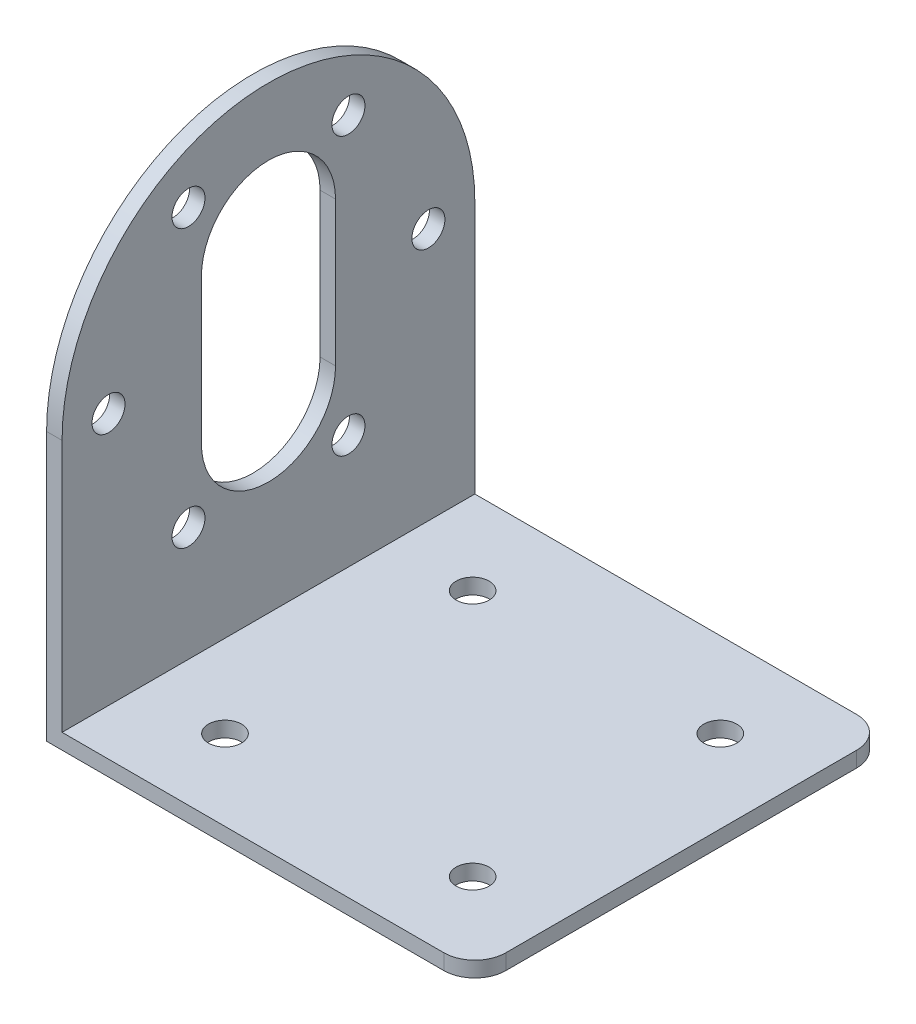
ISO-10303-21;
HEADER;
FILE_DESCRIPTION(('STEP AP214'),'2;1');
FILE_NAME('part.step','',(''),(''),'','','');
FILE_SCHEMA(('AUTOMOTIVE_DESIGN { 1 0 10303 214 1 1 1 1 }'));
ENDSEC;
DATA;
#1=APPLICATION_CONTEXT('core data for automotive mechanical design processes');
#2=APPLICATION_PROTOCOL_DEFINITION('international standard','automotive_design',2000,#1);
#3=PRODUCT_CONTEXT('',#1,'mechanical');
#4=PRODUCT('Part','Part','',(#3));
#5=PRODUCT_RELATED_PRODUCT_CATEGORY('part','',(#4));
#6=PRODUCT_DEFINITION_FORMATION('','',#4);
#7=PRODUCT_DEFINITION_CONTEXT('part definition',#1,'design');
#8=PRODUCT_DEFINITION('design','',#6,#7);
#9=PRODUCT_DEFINITION_SHAPE('','',#8);
#10=(LENGTH_UNIT() NAMED_UNIT(*) SI_UNIT(.MILLI.,.METRE.));
#11=(NAMED_UNIT(*) PLANE_ANGLE_UNIT() SI_UNIT($,.RADIAN.));
#12=(NAMED_UNIT(*) SI_UNIT($,.STERADIAN.) SOLID_ANGLE_UNIT());
#13=UNCERTAINTY_MEASURE_WITH_UNIT(LENGTH_MEASURE(1.E-05),#10,'distance_accuracy_value','');
#14=(GEOMETRIC_REPRESENTATION_CONTEXT(3) GLOBAL_UNCERTAINTY_ASSIGNED_CONTEXT((#13)) GLOBAL_UNIT_ASSIGNED_CONTEXT((#10,
#11,#12)) REPRESENTATION_CONTEXT('',''));
#15=CARTESIAN_POINT('',(0.,0.,0.));
#16=DIRECTION('',(0.,0.,1.));
#17=DIRECTION('',(1.,0.,0.));
#18=AXIS2_PLACEMENT_3D('',#15,#16,#17);
#19=CARTESIAN_POINT('',(0.,1.5,0.));
#20=DIRECTION('',(1.,0.,0.));
#21=DIRECTION('',(0.,0.,-1.));
#22=AXIS2_PLACEMENT_3D('',#19,#20,#21);
#23=PLANE('',#22);
#24=CARTESIAN_POINT('',(0.,39.4233937586586,-12.2499999999997));
#25=DIRECTION('',(-1.,0.,0.));
#26=DIRECTION('',(0.,0.,1.));
#27=AXIS2_PLACEMENT_3D('',#24,#25,#26);
#28=CIRCLE('',#27,1.6);
#29=CARTESIAN_POINT('',(0.,39.4233937586586,-10.6499999999997));
#30=VERTEX_POINT('',#29);
#31=EDGE_CURVE('E265',#30,#30,#28,.T.);
#32=ORIENTED_EDGE('',*,*,#31,.F.);
#33=EDGE_LOOP('',(#32));
#34=FACE_BOUND('',#33,.T.);
#35=CARTESIAN_POINT('',(0.,25.9999999999999,-4.49999999999962));
#36=DIRECTION('',(-1.,0.,0.));
#37=DIRECTION('',(0.,0.,1.));
#38=AXIS2_PLACEMENT_3D('',#35,#36,#37);
#39=CIRCLE('',#38,1.6);
#40=CARTESIAN_POINT('',(0.,25.9999999999999,-2.89999999999961));
#41=VERTEX_POINT('',#40);
#42=EDGE_CURVE('E261',#41,#41,#39,.T.);
#43=ORIENTED_EDGE('',*,*,#42,.F.);
#44=EDGE_LOOP('',(#43));
#45=FACE_BOUND('',#44,.T.);
#46=CARTESIAN_POINT('',(0.,12.576606241341,-12.2499999999995));
#47=DIRECTION('',(-1.,0.,0.));
#48=DIRECTION('',(0.,0.,1.));
#49=AXIS2_PLACEMENT_3D('',#46,#47,#48);
#50=CIRCLE('',#49,1.6);
#51=CARTESIAN_POINT('',(0.,12.576606241341,-10.6499999999995));
#52=VERTEX_POINT('',#51);
#53=EDGE_CURVE('E257',#52,#52,#50,.T.);
#54=ORIENTED_EDGE('',*,*,#53,.F.);
#55=EDGE_LOOP('',(#54));
#56=FACE_BOUND('',#55,.T.);
#57=CARTESIAN_POINT('',(0.,12.5766062413409,-27.7499999999995));
#58=DIRECTION('',(-1.,0.,0.));
#59=DIRECTION('',(0.,0.,1.));
#60=AXIS2_PLACEMENT_3D('',#57,#58,#59);
#61=CIRCLE('',#60,1.6);
#62=CARTESIAN_POINT('',(0.,12.5766062413409,-26.1499999999995));
#63=VERTEX_POINT('',#62);
#64=EDGE_CURVE('E253',#63,#63,#61,.T.);
#65=ORIENTED_EDGE('',*,*,#64,.F.);
#66=EDGE_LOOP('',(#65));
#67=FACE_BOUND('',#66,.T.);
#68=CARTESIAN_POINT('',(0.,25.9999999999997,-35.4999999999996));
#69=DIRECTION('',(-1.,0.,0.));
#70=DIRECTION('',(0.,0.,1.));
#71=AXIS2_PLACEMENT_3D('',#68,#69,#70);
#72=CIRCLE('',#71,1.6);
#73=CARTESIAN_POINT('',(0.,25.9999999999997,-33.8999999999996));
#74=VERTEX_POINT('',#73);
#75=EDGE_CURVE('E249',#74,#74,#72,.T.);
#76=ORIENTED_EDGE('',*,*,#75,.F.);
#77=EDGE_LOOP('',(#76));
#78=FACE_BOUND('',#77,.T.);
#79=CARTESIAN_POINT('',(0.,39.4233937586585,-27.7499999999997));
#80=DIRECTION('',(-1.,0.,0.));
#81=DIRECTION('',(0.,0.,1.));
#82=AXIS2_PLACEMENT_3D('',#79,#80,#81);
#83=CIRCLE('',#82,1.6);
#84=CARTESIAN_POINT('',(0.,39.4233937586585,-26.1499999999997));
#85=VERTEX_POINT('',#84);
#86=EDGE_CURVE('E198',#85,#85,#83,.T.);
#87=ORIENTED_EDGE('',*,*,#86,.F.);
#88=EDGE_LOOP('',(#87));
#89=FACE_BOUND('',#88,.T.);
#90=DIRECTION('',(0.,-1.,0.));
#91=VECTOR('',#90,1.);
#92=CARTESIAN_POINT('',(0.,1.5,0.));
#93=LINE('',#92,#91);
#94=CARTESIAN_POINT('',(0.,26.,0.));
#95=VERTEX_POINT('',#94);
#96=CARTESIAN_POINT('',(0.,0.,0.));
#97=VERTEX_POINT('',#96);
#98=EDGE_CURVE('E284',#95,#97,#93,.T.);
#99=ORIENTED_EDGE('',*,*,#98,.F.);
#100=CARTESIAN_POINT('',(0.,26.,-20.));
#101=DIRECTION('',(-1.,0.,0.));
#102=DIRECTION('',(0.,0.,1.));
#103=AXIS2_PLACEMENT_3D('',#100,#101,#102);
#104=CIRCLE('',#103,20.);
#105=CARTESIAN_POINT('',(0.,26.,-40.));
#106=VERTEX_POINT('',#105);
#107=EDGE_CURVE('E217',#106,#95,#104,.F.);
#108=ORIENTED_EDGE('',*,*,#107,.F.);
#109=DIRECTION('',(0.,-1.,0.));
#110=VECTOR('',#109,1.);
#111=CARTESIAN_POINT('',(0.,1.5,-40.));
#112=LINE('',#111,#110);
#113=CARTESIAN_POINT('',(0.,0.,-40.));
#114=VERTEX_POINT('',#113);
#115=EDGE_CURVE('E269',#106,#114,#112,.T.);
#116=ORIENTED_EDGE('',*,*,#115,.T.);
#117=DIRECTION('',(0.,0.,1.));
#118=VECTOR('',#117,1.);
#119=CARTESIAN_POINT('',(0.,0.,0.));
#120=LINE('',#119,#118);
#121=EDGE_CURVE('E243',#114,#97,#120,.T.);
#122=ORIENTED_EDGE('',*,*,#121,.T.);
#123=EDGE_LOOP('',(#99,#108,#116,#122));
#124=FACE_BOUND('',#123,.T.);
#125=DIRECTION('',(0.,1.,0.));
#126=VECTOR('',#125,1.);
#127=CARTESIAN_POINT('',(0.,0.,-26.5));
#128=LINE('',#127,#126);
#129=CARTESIAN_POINT('',(0.,19.,-26.5));
#130=VERTEX_POINT('',#129);
#131=CARTESIAN_POINT('',(0.,33.,-26.5));
#132=VERTEX_POINT('',#131);
#133=EDGE_CURVE('E175',#130,#132,#128,.T.);
#134=ORIENTED_EDGE('',*,*,#133,.T.);
#135=CARTESIAN_POINT('',(0.,33.,-20.));
#136=DIRECTION('',(-1.,0.,0.));
#137=DIRECTION('',(0.,0.,1.));
#138=AXIS2_PLACEMENT_3D('',#135,#136,#137);
#139=CIRCLE('',#138,6.5);
#140=CARTESIAN_POINT('',(0.,33.,-13.5));
#141=VERTEX_POINT('',#140);
#142=EDGE_CURVE('E192',#132,#141,#139,.F.);
#143=ORIENTED_EDGE('',*,*,#142,.T.);
#144=DIRECTION('',(0.,1.,0.));
#145=VECTOR('',#144,1.);
#146=CARTESIAN_POINT('',(0.,0.,-13.5));
#147=LINE('',#146,#145);
#148=CARTESIAN_POINT('',(0.,19.,-13.5));
#149=VERTEX_POINT('',#148);
#150=EDGE_CURVE('E195',#149,#141,#147,.T.);
#151=ORIENTED_EDGE('',*,*,#150,.F.);
#152=CARTESIAN_POINT('',(0.,19.,-20.));
#153=DIRECTION('',(-1.,0.,0.));
#154=DIRECTION('',(0.,0.,1.));
#155=AXIS2_PLACEMENT_3D('',#152,#153,#154);
#156=CIRCLE('',#155,6.5);
#157=EDGE_CURVE('E204',#130,#149,#156,.T.);
#158=ORIENTED_EDGE('',*,*,#157,.F.);
#159=EDGE_LOOP('',(#134,#143,#151,#158));
#160=FACE_BOUND('',#159,.T.);
#161=ADVANCED_FACE('F77',(#34,#45,#56,#67,#78,#89,#124,#160),#23,.F.);
#162=CARTESIAN_POINT('',(1.5,46.,-40.));
#163=DIRECTION('',(-1.,0.,0.));
#164=DIRECTION('',(0.,0.,1.));
#165=AXIS2_PLACEMENT_3D('',#162,#163,#164);
#166=PLANE('',#165);
#167=CARTESIAN_POINT('',(1.5,39.4233937586586,-12.2499999999997));
#168=DIRECTION('',(-1.,0.,0.));
#169=DIRECTION('',(0.,0.,1.));
#170=AXIS2_PLACEMENT_3D('',#167,#168,#169);
#171=CIRCLE('',#170,1.59999999999999);
#172=CARTESIAN_POINT('',(1.5,39.4233937586586,-10.6499999999997));
#173=VERTEX_POINT('',#172);
#174=EDGE_CURVE('E262',#173,#173,#171,.T.);
#175=ORIENTED_EDGE('',*,*,#174,.T.);
#176=EDGE_LOOP('',(#175));
#177=FACE_BOUND('',#176,.T.);
#178=CARTESIAN_POINT('',(1.5,25.9999999999999,-4.49999999999962));
#179=DIRECTION('',(-1.,0.,0.));
#180=DIRECTION('',(0.,0.,1.));
#181=AXIS2_PLACEMENT_3D('',#178,#179,#180);
#182=CIRCLE('',#181,1.6);
#183=CARTESIAN_POINT('',(1.5,25.9999999999999,-2.89999999999962));
#184=VERTEX_POINT('',#183);
#185=EDGE_CURVE('E258',#184,#184,#182,.T.);
#186=ORIENTED_EDGE('',*,*,#185,.T.);
#187=EDGE_LOOP('',(#186));
#188=FACE_BOUND('',#187,.T.);
#189=CARTESIAN_POINT('',(1.5,12.576606241341,-12.2499999999995));
#190=DIRECTION('',(-1.,0.,0.));
#191=DIRECTION('',(0.,0.,1.));
#192=AXIS2_PLACEMENT_3D('',#189,#190,#191);
#193=CIRCLE('',#192,1.6);
#194=CARTESIAN_POINT('',(1.5,12.576606241341,-10.6499999999995));
#195=VERTEX_POINT('',#194);
#196=EDGE_CURVE('E254',#195,#195,#193,.T.);
#197=ORIENTED_EDGE('',*,*,#196,.T.);
#198=EDGE_LOOP('',(#197));
#199=FACE_BOUND('',#198,.T.);
#200=CARTESIAN_POINT('',(1.5,12.5766062413409,-27.7499999999995));
#201=DIRECTION('',(-1.,0.,0.));
#202=DIRECTION('',(0.,0.,1.));
#203=AXIS2_PLACEMENT_3D('',#200,#201,#202);
#204=CIRCLE('',#203,1.6);
#205=CARTESIAN_POINT('',(1.5,12.5766062413409,-26.1499999999995));
#206=VERTEX_POINT('',#205);
#207=EDGE_CURVE('E250',#206,#206,#204,.T.);
#208=ORIENTED_EDGE('',*,*,#207,.T.);
#209=EDGE_LOOP('',(#208));
#210=FACE_BOUND('',#209,.T.);
#211=CARTESIAN_POINT('',(1.5,25.9999999999997,-35.4999999999996));
#212=DIRECTION('',(-1.,0.,0.));
#213=DIRECTION('',(0.,0.,1.));
#214=AXIS2_PLACEMENT_3D('',#211,#212,#213);
#215=CIRCLE('',#214,1.6);
#216=CARTESIAN_POINT('',(1.5,25.9999999999997,-33.8999999999996));
#217=VERTEX_POINT('',#216);
#218=EDGE_CURVE('E246',#217,#217,#215,.T.);
#219=ORIENTED_EDGE('',*,*,#218,.T.);
#220=EDGE_LOOP('',(#219));
#221=FACE_BOUND('',#220,.T.);
#222=CARTESIAN_POINT('',(1.5,39.4233937586585,-27.7499999999997));
#223=DIRECTION('',(-1.,0.,0.));
#224=DIRECTION('',(0.,0.,1.));
#225=AXIS2_PLACEMENT_3D('',#222,#223,#224);
#226=CIRCLE('',#225,1.59999999999999);
#227=CARTESIAN_POINT('',(1.5,39.4233937586585,-26.1499999999997));
#228=VERTEX_POINT('',#227);
#229=EDGE_CURVE('E205',#228,#228,#226,.T.);
#230=ORIENTED_EDGE('',*,*,#229,.T.);
#231=EDGE_LOOP('',(#230));
#232=FACE_BOUND('',#231,.T.);
#233=CARTESIAN_POINT('',(1.5,26.,-20.));
#234=DIRECTION('',(-1.,0.,0.));
#235=DIRECTION('',(0.,0.,1.));
#236=AXIS2_PLACEMENT_3D('',#233,#234,#235);
#237=CIRCLE('',#236,20.);
#238=CARTESIAN_POINT('',(1.5,26.,-40.));
#239=VERTEX_POINT('',#238);
#240=CARTESIAN_POINT('',(1.5,26.,0.));
#241=VERTEX_POINT('',#240);
#242=EDGE_CURVE('E218',#239,#241,#237,.F.);
#243=ORIENTED_EDGE('',*,*,#242,.T.);
#244=DIRECTION('',(0.,-1.,0.));
#245=VECTOR('',#244,1.);
#246=CARTESIAN_POINT('',(1.50000000000001,46.,0.));
#247=LINE('',#246,#245);
#248=CARTESIAN_POINT('',(1.5,1.5,0.));
#249=VERTEX_POINT('',#248);
#250=EDGE_CURVE('E241',#241,#249,#247,.T.);
#251=ORIENTED_EDGE('',*,*,#250,.T.);
#252=DIRECTION('',(0.,0.,-1.));
#253=VECTOR('',#252,1.);
#254=CARTESIAN_POINT('',(1.5,1.5,-40.));
#255=LINE('',#254,#253);
#256=CARTESIAN_POINT('',(1.5,1.5,-40.));
#257=VERTEX_POINT('',#256);
#258=EDGE_CURVE('E223',#249,#257,#255,.T.);
#259=ORIENTED_EDGE('',*,*,#258,.T.);
#260=DIRECTION('',(0.,-1.,0.));
#261=VECTOR('',#260,1.);
#262=CARTESIAN_POINT('',(1.5,46.,-40.));
#263=LINE('',#262,#261);
#264=EDGE_CURVE('E232',#239,#257,#263,.T.);
#265=ORIENTED_EDGE('',*,*,#264,.F.);
#266=EDGE_LOOP('',(#243,#251,#259,#265));
#267=FACE_BOUND('',#266,.T.);
#268=DIRECTION('',(0.,1.,0.));
#269=VECTOR('',#268,1.);
#270=CARTESIAN_POINT('',(1.5,0.,-26.5));
#271=LINE('',#270,#269);
#272=CARTESIAN_POINT('',(1.5,19.,-26.5));
#273=VERTEX_POINT('',#272);
#274=CARTESIAN_POINT('',(1.5,33.,-26.5));
#275=VERTEX_POINT('',#274);
#276=EDGE_CURVE('E172',#273,#275,#271,.T.);
#277=ORIENTED_EDGE('',*,*,#276,.F.);
#278=CARTESIAN_POINT('',(1.5,19.,-20.));
#279=DIRECTION('',(-1.,0.,0.));
#280=DIRECTION('',(0.,0.,1.));
#281=AXIS2_PLACEMENT_3D('',#278,#279,#280);
#282=CIRCLE('',#281,6.5);
#283=CARTESIAN_POINT('',(1.5,19.,-13.5));
#284=VERTEX_POINT('',#283);
#285=EDGE_CURVE('E184',#273,#284,#282,.T.);
#286=ORIENTED_EDGE('',*,*,#285,.T.);
#287=DIRECTION('',(0.,1.,0.));
#288=VECTOR('',#287,1.);
#289=CARTESIAN_POINT('',(1.5,0.,-13.5));
#290=LINE('',#289,#288);
#291=CARTESIAN_POINT('',(1.5,33.,-13.5));
#292=VERTEX_POINT('',#291);
#293=EDGE_CURVE('E188',#284,#292,#290,.T.);
#294=ORIENTED_EDGE('',*,*,#293,.T.);
#295=CARTESIAN_POINT('',(1.5,33.,-20.));
#296=DIRECTION('',(-1.,0.,0.));
#297=DIRECTION('',(0.,0.,1.));
#298=AXIS2_PLACEMENT_3D('',#295,#296,#297);
#299=CIRCLE('',#298,6.5);
#300=EDGE_CURVE('E180',#275,#292,#299,.F.);
#301=ORIENTED_EDGE('',*,*,#300,.F.);
#302=EDGE_LOOP('',(#277,#286,#294,#301));
#303=FACE_BOUND('',#302,.T.);
#304=ADVANCED_FACE('F191',(#177,#188,#199,#210,#221,#232,#267,#303),#166,.F.);
#305=CARTESIAN_POINT('',(0.,1.5,0.));
#306=DIRECTION('',(0.,0.,-1.));
#307=DIRECTION('',(-1.,0.,0.));
#308=AXIS2_PLACEMENT_3D('',#305,#306,#307);
#309=PLANE('',#308);
#310=DIRECTION('',(1.,0.,0.));
#311=VECTOR('',#310,1.);
#312=CARTESIAN_POINT('',(0.,0.,0.));
#313=LINE('',#312,#311);
#314=CARTESIAN_POINT('',(38.5,0.,0.));
#315=VERTEX_POINT('',#314);
#316=EDGE_CURVE('E277',#97,#315,#313,.T.);
#317=ORIENTED_EDGE('',*,*,#316,.T.);
#318=DIRECTION('',(0.,-1.,0.));
#319=VECTOR('',#318,1.);
#320=CARTESIAN_POINT('',(38.5,1.5,0.));
#321=LINE('',#320,#319);
#322=CARTESIAN_POINT('',(38.5,1.5,0.));
#323=VERTEX_POINT('',#322);
#324=EDGE_CURVE('E12',#315,#323,#321,.F.);
#325=ORIENTED_EDGE('',*,*,#324,.T.);
#326=DIRECTION('',(1.,0.,0.));
#327=VECTOR('',#326,1.);
#328=CARTESIAN_POINT('',(0.,1.5,0.));
#329=LINE('',#328,#327);
#330=EDGE_CURVE('E233',#249,#323,#329,.T.);
#331=ORIENTED_EDGE('',*,*,#330,.F.);
#332=ORIENTED_EDGE('',*,*,#250,.F.);
#333=DIRECTION('',(-1.,0.,0.));
#334=VECTOR('',#333,1.);
#335=CARTESIAN_POINT('',(1.5,26.,0.));
#336=LINE('',#335,#334);
#337=EDGE_CURVE('E211',#241,#95,#336,.T.);
#338=ORIENTED_EDGE('',*,*,#337,.T.);
#339=ORIENTED_EDGE('',*,*,#98,.T.);
#340=EDGE_LOOP('',(#317,#325,#331,#332,#338,#339));
#341=FACE_BOUND('',#340,.T.);
#342=ADVANCED_FACE('F319',(#341),#309,.F.);
#343=CARTESIAN_POINT('',(0.,1.5,0.));
#344=DIRECTION('',(0.,-1.,0.));
#345=DIRECTION('',(0.,0.,-1.));
#346=AXIS2_PLACEMENT_3D('',#343,#344,#345);
#347=PLANE('',#346);
#348=CARTESIAN_POINT('',(9.5,1.5,-31.7860000629073));
#349=DIRECTION('',(0.,-1.,0.));
#350=DIRECTION('',(0.,0.,-1.));
#351=AXIS2_PLACEMENT_3D('',#348,#349,#350);
#352=CIRCLE('',#351,1.59999999999999);
#353=CARTESIAN_POINT('',(9.5,1.5,-33.3860000629073));
#354=VERTEX_POINT('',#353);
#355=EDGE_CURVE('E450',#354,#354,#352,.T.);
#356=ORIENTED_EDGE('',*,*,#355,.T.);
#357=EDGE_LOOP('',(#356));
#358=FACE_BOUND('',#357,.T.);
#359=CARTESIAN_POINT('',(33.5,1.5,-31.7860000629073));
#360=DIRECTION('',(0.,-1.,0.));
#361=DIRECTION('',(0.,0.,-1.));
#362=AXIS2_PLACEMENT_3D('',#359,#360,#361);
#363=CIRCLE('',#362,1.6);
#364=CARTESIAN_POINT('',(33.5,1.5,-33.3860000629073));
#365=VERTEX_POINT('',#364);
#366=EDGE_CURVE('E444',#365,#365,#363,.T.);
#367=ORIENTED_EDGE('',*,*,#366,.T.);
#368=EDGE_LOOP('',(#367));
#369=FACE_BOUND('',#368,.T.);
#370=CARTESIAN_POINT('',(33.5,1.5,-7.78600006290731));
#371=DIRECTION('',(0.,-1.,0.));
#372=DIRECTION('',(0.,0.,-1.));
#373=AXIS2_PLACEMENT_3D('',#370,#371,#372);
#374=CIRCLE('',#373,1.6);
#375=CARTESIAN_POINT('',(33.5,1.5,-9.3860000629073));
#376=VERTEX_POINT('',#375);
#377=EDGE_CURVE('E438',#376,#376,#374,.T.);
#378=ORIENTED_EDGE('',*,*,#377,.T.);
#379=EDGE_LOOP('',(#378));
#380=FACE_BOUND('',#379,.T.);
#381=CARTESIAN_POINT('',(9.5,1.5,-7.78600006290731));
#382=DIRECTION('',(0.,-1.,0.));
#383=DIRECTION('',(0.,0.,-1.));
#384=AXIS2_PLACEMENT_3D('',#381,#382,#383);
#385=CIRCLE('',#384,1.59999999999999);
#386=CARTESIAN_POINT('',(9.5,1.5,-9.3860000629073));
#387=VERTEX_POINT('',#386);
#388=EDGE_CURVE('E432',#387,#387,#385,.T.);
#389=ORIENTED_EDGE('',*,*,#388,.T.);
#390=EDGE_LOOP('',(#389));
#391=FACE_BOUND('',#390,.T.);
#392=DIRECTION('',(0.,0.,-1.));
#393=VECTOR('',#392,1.);
#394=CARTESIAN_POINT('',(41.5,1.5,0.));
#395=LINE('',#394,#393);
#396=CARTESIAN_POINT('',(41.5,1.5,-3.));
#397=VERTEX_POINT('',#396);
#398=CARTESIAN_POINT('',(41.5,1.5,-37.));
#399=VERTEX_POINT('',#398);
#400=EDGE_CURVE('E270',#397,#399,#395,.T.);
#401=ORIENTED_EDGE('',*,*,#400,.T.);
#402=CARTESIAN_POINT('',(38.5,1.5,-37.));
#403=DIRECTION('',(0.,-1.,0.));
#404=DIRECTION('',(0.,0.,-1.));
#405=AXIS2_PLACEMENT_3D('',#402,#403,#404);
#406=CIRCLE('',#405,3.);
#407=CARTESIAN_POINT('',(38.5,1.5,-40.));
#408=VERTEX_POINT('',#407);
#409=EDGE_CURVE('E85',#399,#408,#406,.F.);
#410=ORIENTED_EDGE('',*,*,#409,.T.);
#411=DIRECTION('',(-1.,0.,0.));
#412=VECTOR('',#411,1.);
#413=CARTESIAN_POINT('',(0.,1.5,-40.));
#414=LINE('',#413,#412);
#415=EDGE_CURVE('E266',#408,#257,#414,.T.);
#416=ORIENTED_EDGE('',*,*,#415,.T.);
#417=ORIENTED_EDGE('',*,*,#258,.F.);
#418=ORIENTED_EDGE('',*,*,#330,.T.);
#419=CARTESIAN_POINT('',(38.5,1.5,-3.));
#420=DIRECTION('',(0.,-1.,0.));
#421=DIRECTION('',(0.,0.,-1.));
#422=AXIS2_PLACEMENT_3D('',#419,#420,#421);
#423=CIRCLE('',#422,3.);
#424=EDGE_CURVE('E302',#323,#397,#423,.F.);
#425=ORIENTED_EDGE('',*,*,#424,.T.);
#426=EDGE_LOOP('',(#401,#410,#416,#417,#418,#425));
#427=FACE_BOUND('',#426,.T.);
#428=ADVANCED_FACE('F305',(#358,#369,#380,#391,#427),#347,.F.);
#429=CARTESIAN_POINT('',(41.5,1.5,0.));
#430=DIRECTION('',(-1.,0.,0.));
#431=DIRECTION('',(0.,0.,1.));
#432=AXIS2_PLACEMENT_3D('',#429,#430,#431);
#433=PLANE('',#432);
#434=DIRECTION('',(0.,0.,-1.));
#435=VECTOR('',#434,1.);
#436=CARTESIAN_POINT('',(41.5,0.,0.));
#437=LINE('',#436,#435);
#438=CARTESIAN_POINT('',(41.5,0.,-3.));
#439=VERTEX_POINT('',#438);
#440=CARTESIAN_POINT('',(41.5,0.,-37.));
#441=VERTEX_POINT('',#440);
#442=EDGE_CURVE('E279',#439,#441,#437,.T.);
#443=ORIENTED_EDGE('',*,*,#442,.T.);
#444=DIRECTION('',(0.,-1.,0.));
#445=VECTOR('',#444,1.);
#446=CARTESIAN_POINT('',(41.5,1.5,-37.));
#447=LINE('',#446,#445);
#448=EDGE_CURVE('E98',#441,#399,#447,.F.);
#449=ORIENTED_EDGE('',*,*,#448,.T.);
#450=ORIENTED_EDGE('',*,*,#400,.F.);
#451=DIRECTION('',(0.,-1.,0.));
#452=VECTOR('',#451,1.);
#453=CARTESIAN_POINT('',(41.5,1.5,-3.));
#454=LINE('',#453,#452);
#455=EDGE_CURVE('E296',#397,#439,#454,.T.);
#456=ORIENTED_EDGE('',*,*,#455,.T.);
#457=EDGE_LOOP('',(#443,#449,#450,#456));
#458=FACE_BOUND('',#457,.T.);
#459=ADVANCED_FACE('F314',(#458),#433,.F.);
#460=CARTESIAN_POINT('',(0.,1.5,-40.));
#461=DIRECTION('',(0.,0.,1.));
#462=DIRECTION('',(1.,0.,0.));
#463=AXIS2_PLACEMENT_3D('',#460,#461,#462);
#464=PLANE('',#463);
#465=ORIENTED_EDGE('',*,*,#415,.F.);
#466=DIRECTION('',(0.,-1.,0.));
#467=VECTOR('',#466,1.);
#468=CARTESIAN_POINT('',(38.5,1.5,-40.));
#469=LINE('',#468,#467);
#470=CARTESIAN_POINT('',(38.5,0.,-40.));
#471=VERTEX_POINT('',#470);
#472=EDGE_CURVE('E271',#408,#471,#469,.T.);
#473=ORIENTED_EDGE('',*,*,#472,.T.);
#474=DIRECTION('',(-1.,0.,0.));
#475=VECTOR('',#474,1.);
#476=CARTESIAN_POINT('',(0.,0.,-40.));
#477=LINE('',#476,#475);
#478=EDGE_CURVE('E281',#471,#114,#477,.T.);
#479=ORIENTED_EDGE('',*,*,#478,.T.);
#480=ORIENTED_EDGE('',*,*,#115,.F.);
#481=DIRECTION('',(-1.,0.,0.));
#482=VECTOR('',#481,1.);
#483=CARTESIAN_POINT('',(1.5,26.,-40.));
#484=LINE('',#483,#482);
#485=EDGE_CURVE('E220',#239,#106,#484,.T.);
#486=ORIENTED_EDGE('',*,*,#485,.F.);
#487=ORIENTED_EDGE('',*,*,#264,.T.);
#488=EDGE_LOOP('',(#465,#473,#479,#480,#486,#487));
#489=FACE_BOUND('',#488,.T.);
#490=ADVANCED_FACE('F308',(#489),#464,.F.);
#491=CARTESIAN_POINT('',(0.,0.,0.));
#492=DIRECTION('',(0.,-1.,0.));
#493=DIRECTION('',(0.,0.,-1.));
#494=AXIS2_PLACEMENT_3D('',#491,#492,#493);
#495=PLANE('',#494);
#496=CARTESIAN_POINT('',(9.5,0.,-31.7860000629073));
#497=DIRECTION('',(0.,-1.,0.));
#498=DIRECTION('',(0.,0.,-1.));
#499=AXIS2_PLACEMENT_3D('',#496,#497,#498);
#500=CIRCLE('',#499,1.59999999999999);
#501=CARTESIAN_POINT('',(9.5,0.,-33.3860000629073));
#502=VERTEX_POINT('',#501);
#503=EDGE_CURVE('E453',#502,#502,#500,.T.);
#504=ORIENTED_EDGE('',*,*,#503,.F.);
#505=EDGE_LOOP('',(#504));
#506=FACE_BOUND('',#505,.T.);
#507=CARTESIAN_POINT('',(33.5,0.,-31.7860000629073));
#508=DIRECTION('',(0.,-1.,0.));
#509=DIRECTION('',(0.,0.,-1.));
#510=AXIS2_PLACEMENT_3D('',#507,#508,#509);
#511=CIRCLE('',#510,1.59999999999999);
#512=CARTESIAN_POINT('',(33.5,0.,-33.3860000629073));
#513=VERTEX_POINT('',#512);
#514=EDGE_CURVE('E447',#513,#513,#511,.T.);
#515=ORIENTED_EDGE('',*,*,#514,.F.);
#516=EDGE_LOOP('',(#515));
#517=FACE_BOUND('',#516,.T.);
#518=CARTESIAN_POINT('',(33.5,0.,-7.78600006290731));
#519=DIRECTION('',(0.,-1.,0.));
#520=DIRECTION('',(0.,0.,-1.));
#521=AXIS2_PLACEMENT_3D('',#518,#519,#520);
#522=CIRCLE('',#521,1.59999999999999);
#523=CARTESIAN_POINT('',(33.5,0.,-9.3860000629073));
#524=VERTEX_POINT('',#523);
#525=EDGE_CURVE('E441',#524,#524,#522,.T.);
#526=ORIENTED_EDGE('',*,*,#525,.F.);
#527=EDGE_LOOP('',(#526));
#528=FACE_BOUND('',#527,.T.);
#529=CARTESIAN_POINT('',(9.5,0.,-7.78600006290731));
#530=DIRECTION('',(0.,-1.,0.));
#531=DIRECTION('',(0.,0.,-1.));
#532=AXIS2_PLACEMENT_3D('',#529,#530,#531);
#533=CIRCLE('',#532,1.59999999999999);
#534=CARTESIAN_POINT('',(9.5,0.,-9.38600006290729));
#535=VERTEX_POINT('',#534);
#536=EDGE_CURVE('E435',#535,#535,#533,.T.);
#537=ORIENTED_EDGE('',*,*,#536,.F.);
#538=EDGE_LOOP('',(#537));
#539=FACE_BOUND('',#538,.T.);
#540=ORIENTED_EDGE('',*,*,#478,.F.);
#541=CARTESIAN_POINT('',(38.5,0.,-37.));
#542=DIRECTION('',(0.,-1.,0.));
#543=DIRECTION('',(0.,0.,-1.));
#544=AXIS2_PLACEMENT_3D('',#541,#542,#543);
#545=CIRCLE('',#544,3.);
#546=EDGE_CURVE('E293',#471,#441,#545,.T.);
#547=ORIENTED_EDGE('',*,*,#546,.T.);
#548=ORIENTED_EDGE('',*,*,#442,.F.);
#549=CARTESIAN_POINT('',(38.5,0.,-3.));
#550=DIRECTION('',(0.,-1.,0.));
#551=DIRECTION('',(0.,0.,-1.));
#552=AXIS2_PLACEMENT_3D('',#549,#550,#551);
#553=CIRCLE('',#552,3.);
#554=EDGE_CURVE('E288',#439,#315,#553,.T.);
#555=ORIENTED_EDGE('',*,*,#554,.T.);
#556=ORIENTED_EDGE('',*,*,#316,.F.);
#557=ORIENTED_EDGE('',*,*,#121,.F.);
#558=EDGE_LOOP('',(#540,#547,#548,#555,#556,#557));
#559=FACE_BOUND('',#558,.T.);
#560=ADVANCED_FACE('F312',(#506,#517,#528,#539,#559),#495,.T.);
#561=CARTESIAN_POINT('',(1.5,26.,-20.));
#562=DIRECTION('',(-1.,0.,0.));
#563=DIRECTION('',(0.,0.,1.));
#564=AXIS2_PLACEMENT_3D('',#561,#562,#563);
#565=CYLINDRICAL_SURFACE('',#564,20.);
#566=ORIENTED_EDGE('',*,*,#107,.T.);
#567=ORIENTED_EDGE('',*,*,#337,.F.);
#568=ORIENTED_EDGE('',*,*,#242,.F.);
#569=ORIENTED_EDGE('',*,*,#485,.T.);
#570=EDGE_LOOP('',(#566,#567,#568,#569));
#571=FACE_BOUND('',#570,.T.);
#572=ADVANCED_FACE('F323',(#571),#565,.T.);
#573=CARTESIAN_POINT('',(1.5,0.,-26.5));
#574=DIRECTION('',(0.,0.,1.));
#575=DIRECTION('',(1.,0.,0.));
#576=AXIS2_PLACEMENT_3D('',#573,#574,#575);
#577=PLANE('',#576);
#578=ORIENTED_EDGE('',*,*,#133,.F.);
#579=DIRECTION('',(-1.,0.,0.));
#580=VECTOR('',#579,1.);
#581=CARTESIAN_POINT('',(1.5,19.,-26.5));
#582=LINE('',#581,#580);
#583=EDGE_CURVE('E167',#273,#130,#582,.T.);
#584=ORIENTED_EDGE('',*,*,#583,.F.);
#585=ORIENTED_EDGE('',*,*,#276,.T.);
#586=DIRECTION('',(-1.,0.,0.));
#587=VECTOR('',#586,1.);
#588=CARTESIAN_POINT('',(1.5,33.,-26.5));
#589=LINE('',#588,#587);
#590=EDGE_CURVE('E209',#275,#132,#589,.T.);
#591=ORIENTED_EDGE('',*,*,#590,.T.);
#592=EDGE_LOOP('',(#578,#584,#585,#591));
#593=FACE_BOUND('',#592,.T.);
#594=ADVANCED_FACE('F169',(#593),#577,.T.);
#595=CARTESIAN_POINT('',(1.5,33.,-20.));
#596=DIRECTION('',(-1.,0.,0.));
#597=DIRECTION('',(0.,0.,1.));
#598=AXIS2_PLACEMENT_3D('',#595,#596,#597);
#599=CYLINDRICAL_SURFACE('',#598,6.5);
#600=ORIENTED_EDGE('',*,*,#142,.F.);
#601=ORIENTED_EDGE('',*,*,#590,.F.);
#602=ORIENTED_EDGE('',*,*,#300,.T.);
#603=DIRECTION('',(-1.,0.,0.));
#604=VECTOR('',#603,1.);
#605=CARTESIAN_POINT('',(1.5,33.,-13.5));
#606=LINE('',#605,#604);
#607=EDGE_CURVE('E212',#292,#141,#606,.T.);
#608=ORIENTED_EDGE('',*,*,#607,.T.);
#609=EDGE_LOOP('',(#600,#601,#602,#608));
#610=FACE_BOUND('',#609,.T.);
#611=ADVANCED_FACE('F336',(#610),#599,.F.);
#612=CARTESIAN_POINT('',(1.5,0.,-13.5));
#613=DIRECTION('',(0.,0.,1.));
#614=DIRECTION('',(1.,0.,0.));
#615=AXIS2_PLACEMENT_3D('',#612,#613,#614);
#616=PLANE('',#615);
#617=ORIENTED_EDGE('',*,*,#150,.T.);
#618=ORIENTED_EDGE('',*,*,#607,.F.);
#619=ORIENTED_EDGE('',*,*,#293,.F.);
#620=DIRECTION('',(-1.,0.,0.));
#621=VECTOR('',#620,1.);
#622=CARTESIAN_POINT('',(1.5,19.,-13.5));
#623=LINE('',#622,#621);
#624=EDGE_CURVE('E179',#284,#149,#623,.T.);
#625=ORIENTED_EDGE('',*,*,#624,.T.);
#626=EDGE_LOOP('',(#617,#618,#619,#625));
#627=FACE_BOUND('',#626,.T.);
#628=ADVANCED_FACE('F334',(#627),#616,.F.);
#629=CARTESIAN_POINT('',(1.5,19.,-20.));
#630=DIRECTION('',(-1.,0.,0.));
#631=DIRECTION('',(0.,0.,1.));
#632=AXIS2_PLACEMENT_3D('',#629,#630,#631);
#633=CYLINDRICAL_SURFACE('',#632,6.5);
#634=ORIENTED_EDGE('',*,*,#157,.T.);
#635=ORIENTED_EDGE('',*,*,#624,.F.);
#636=ORIENTED_EDGE('',*,*,#285,.F.);
#637=ORIENTED_EDGE('',*,*,#583,.T.);
#638=EDGE_LOOP('',(#634,#635,#636,#637));
#639=FACE_BOUND('',#638,.T.);
#640=ADVANCED_FACE('F185',(#639),#633,.F.);
#641=CARTESIAN_POINT('',(0.,39.4233937586585,-27.7499999999997));
#642=DIRECTION('',(-1.,0.,0.));
#643=DIRECTION('',(0.,0.,1.));
#644=AXIS2_PLACEMENT_3D('',#641,#642,#643);
#645=CYLINDRICAL_SURFACE('',#644,1.59999999999999);
#646=ORIENTED_EDGE('',*,*,#86,.T.);
#647=EDGE_LOOP('',(#646));
#648=FACE_BOUND('',#647,.T.);
#649=ORIENTED_EDGE('',*,*,#229,.F.);
#650=EDGE_LOOP('',(#649));
#651=FACE_BOUND('',#650,.T.);
#652=ADVANCED_FACE('F346',(#648,#651),#645,.F.);
#653=CARTESIAN_POINT('',(0.,25.9999999999997,-35.4999999999996));
#654=DIRECTION('',(-1.,0.,0.));
#655=DIRECTION('',(0.,0.,1.));
#656=AXIS2_PLACEMENT_3D('',#653,#654,#655);
#657=CYLINDRICAL_SURFACE('',#656,1.6);
#658=ORIENTED_EDGE('',*,*,#75,.T.);
#659=EDGE_LOOP('',(#658));
#660=FACE_BOUND('',#659,.T.);
#661=ORIENTED_EDGE('',*,*,#218,.F.);
#662=EDGE_LOOP('',(#661));
#663=FACE_BOUND('',#662,.T.);
#664=ADVANCED_FACE('F406',(#660,#663),#657,.F.);
#665=CARTESIAN_POINT('',(0.,12.5766062413409,-27.7499999999995));
#666=DIRECTION('',(-1.,0.,0.));
#667=DIRECTION('',(0.,0.,1.));
#668=AXIS2_PLACEMENT_3D('',#665,#666,#667);
#669=CYLINDRICAL_SURFACE('',#668,1.6);
#670=ORIENTED_EDGE('',*,*,#64,.T.);
#671=EDGE_LOOP('',(#670));
#672=FACE_BOUND('',#671,.T.);
#673=ORIENTED_EDGE('',*,*,#207,.F.);
#674=EDGE_LOOP('',(#673));
#675=FACE_BOUND('',#674,.T.);
#676=ADVANCED_FACE('F403',(#672,#675),#669,.F.);
#677=CARTESIAN_POINT('',(0.,12.576606241341,-12.2499999999995));
#678=DIRECTION('',(-1.,0.,0.));
#679=DIRECTION('',(0.,0.,1.));
#680=AXIS2_PLACEMENT_3D('',#677,#678,#679);
#681=CYLINDRICAL_SURFACE('',#680,1.6);
#682=ORIENTED_EDGE('',*,*,#53,.T.);
#683=EDGE_LOOP('',(#682));
#684=FACE_BOUND('',#683,.T.);
#685=ORIENTED_EDGE('',*,*,#196,.F.);
#686=EDGE_LOOP('',(#685));
#687=FACE_BOUND('',#686,.T.);
#688=ADVANCED_FACE('F399',(#684,#687),#681,.F.);
#689=CARTESIAN_POINT('',(0.,25.9999999999999,-4.49999999999962));
#690=DIRECTION('',(-1.,0.,0.));
#691=DIRECTION('',(0.,0.,1.));
#692=AXIS2_PLACEMENT_3D('',#689,#690,#691);
#693=CYLINDRICAL_SURFACE('',#692,1.6);
#694=ORIENTED_EDGE('',*,*,#42,.T.);
#695=EDGE_LOOP('',(#694));
#696=FACE_BOUND('',#695,.T.);
#697=ORIENTED_EDGE('',*,*,#185,.F.);
#698=EDGE_LOOP('',(#697));
#699=FACE_BOUND('',#698,.T.);
#700=ADVANCED_FACE('F395',(#696,#699),#693,.F.);
#701=CARTESIAN_POINT('',(0.,39.4233937586586,-12.2499999999997));
#702=DIRECTION('',(-1.,0.,0.));
#703=DIRECTION('',(0.,0.,1.));
#704=AXIS2_PLACEMENT_3D('',#701,#702,#703);
#705=CYLINDRICAL_SURFACE('',#704,1.59999999999999);
#706=ORIENTED_EDGE('',*,*,#31,.T.);
#707=EDGE_LOOP('',(#706));
#708=FACE_BOUND('',#707,.T.);
#709=ORIENTED_EDGE('',*,*,#174,.F.);
#710=EDGE_LOOP('',(#709));
#711=FACE_BOUND('',#710,.T.);
#712=ADVANCED_FACE('F391',(#708,#711),#705,.F.);
#713=CARTESIAN_POINT('',(9.5,0.,-7.78600006290731));
#714=DIRECTION('',(0.,-1.,0.));
#715=DIRECTION('',(0.,0.,-1.));
#716=AXIS2_PLACEMENT_3D('',#713,#714,#715);
#717=CYLINDRICAL_SURFACE('',#716,1.59999999999999);
#718=ORIENTED_EDGE('',*,*,#388,.F.);
#719=EDGE_LOOP('',(#718));
#720=FACE_BOUND('',#719,.T.);
#721=ORIENTED_EDGE('',*,*,#536,.T.);
#722=EDGE_LOOP('',(#721));
#723=FACE_BOUND('',#722,.T.);
#724=ADVANCED_FACE('F387',(#720,#723),#717,.F.);
#725=CARTESIAN_POINT('',(33.5,0.,-7.78600006290731));
#726=DIRECTION('',(0.,-1.,0.));
#727=DIRECTION('',(0.,0.,-1.));
#728=AXIS2_PLACEMENT_3D('',#725,#726,#727);
#729=CYLINDRICAL_SURFACE('',#728,1.59999999999999);
#730=ORIENTED_EDGE('',*,*,#377,.F.);
#731=EDGE_LOOP('',(#730));
#732=FACE_BOUND('',#731,.T.);
#733=ORIENTED_EDGE('',*,*,#525,.T.);
#734=EDGE_LOOP('',(#733));
#735=FACE_BOUND('',#734,.T.);
#736=ADVANCED_FACE('F379',(#732,#735),#729,.F.);
#737=CARTESIAN_POINT('',(33.5,0.,-31.7860000629073));
#738=DIRECTION('',(0.,-1.,0.));
#739=DIRECTION('',(0.,0.,-1.));
#740=AXIS2_PLACEMENT_3D('',#737,#738,#739);
#741=CYLINDRICAL_SURFACE('',#740,1.59999999999999);
#742=ORIENTED_EDGE('',*,*,#366,.F.);
#743=EDGE_LOOP('',(#742));
#744=FACE_BOUND('',#743,.T.);
#745=ORIENTED_EDGE('',*,*,#514,.T.);
#746=EDGE_LOOP('',(#745));
#747=FACE_BOUND('',#746,.T.);
#748=ADVANCED_FACE('F373',(#744,#747),#741,.F.);
#749=CARTESIAN_POINT('',(9.5,0.,-31.7860000629073));
#750=DIRECTION('',(0.,-1.,0.));
#751=DIRECTION('',(0.,0.,-1.));
#752=AXIS2_PLACEMENT_3D('',#749,#750,#751);
#753=CYLINDRICAL_SURFACE('',#752,1.59999999999999);
#754=ORIENTED_EDGE('',*,*,#355,.F.);
#755=EDGE_LOOP('',(#754));
#756=FACE_BOUND('',#755,.T.);
#757=ORIENTED_EDGE('',*,*,#503,.T.);
#758=EDGE_LOOP('',(#757));
#759=FACE_BOUND('',#758,.T.);
#760=ADVANCED_FACE('F368',(#756,#759),#753,.F.);
#761=CARTESIAN_POINT('',(38.5,1.5,-37.));
#762=DIRECTION('',(0.,-1.,0.));
#763=DIRECTION('',(0.,0.,-1.));
#764=AXIS2_PLACEMENT_3D('',#761,#762,#763);
#765=CYLINDRICAL_SURFACE('',#764,3.);
#766=ORIENTED_EDGE('',*,*,#409,.F.);
#767=ORIENTED_EDGE('',*,*,#448,.F.);
#768=ORIENTED_EDGE('',*,*,#546,.F.);
#769=ORIENTED_EDGE('',*,*,#472,.F.);
#770=EDGE_LOOP('',(#766,#767,#768,#769));
#771=FACE_BOUND('',#770,.T.);
#772=ADVANCED_FACE('F311',(#771),#765,.T.);
#773=CARTESIAN_POINT('',(38.5,1.5,-3.));
#774=DIRECTION('',(0.,-1.,0.));
#775=DIRECTION('',(0.,0.,-1.));
#776=AXIS2_PLACEMENT_3D('',#773,#774,#775);
#777=CYLINDRICAL_SURFACE('',#776,3.);
#778=ORIENTED_EDGE('',*,*,#424,.F.);
#779=ORIENTED_EDGE('',*,*,#324,.F.);
#780=ORIENTED_EDGE('',*,*,#554,.F.);
#781=ORIENTED_EDGE('',*,*,#455,.F.);
#782=EDGE_LOOP('',(#778,#779,#780,#781));
#783=FACE_BOUND('',#782,.T.);
#784=ADVANCED_FACE('F79',(#783),#777,.T.);
#785=CLOSED_SHELL('',(#161,#304,#342,#428,#459,#490,#560,#572,#594,#611,#628,#640,#652,#664,
#676,#688,#700,#712,#724,#736,#748,#760,#772,#784));
#786=MANIFOLD_SOLID_BREP('B2',#785);
#787=ADVANCED_BREP_SHAPE_REPRESENTATION('',(#18,#786),#14);
#788=SHAPE_DEFINITION_REPRESENTATION(#9,#787);
ENDSEC;
END-ISO-10303-21;
